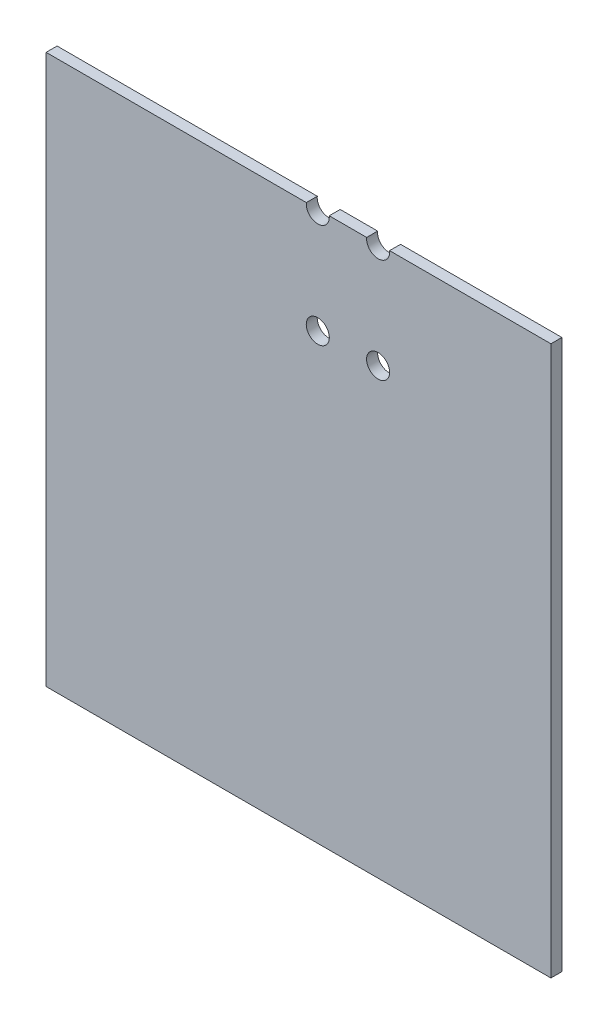
ISO-10303-21;
HEADER;
FILE_DESCRIPTION(('STEP AP214'),'2;1');
FILE_NAME('part.step','',(''),(''),'','','');
FILE_SCHEMA(('AUTOMOTIVE_DESIGN { 1 0 10303 214 1 1 1 1 }'));
ENDSEC;
DATA;
#1=APPLICATION_CONTEXT('core data for automotive mechanical design processes');
#2=APPLICATION_PROTOCOL_DEFINITION('international standard','automotive_design',2000,#1);
#3=PRODUCT_CONTEXT('',#1,'mechanical');
#4=PRODUCT('Part','Part','',(#3));
#5=PRODUCT_RELATED_PRODUCT_CATEGORY('part','',(#4));
#6=PRODUCT_DEFINITION_FORMATION('','',#4);
#7=PRODUCT_DEFINITION_CONTEXT('part definition',#1,'design');
#8=PRODUCT_DEFINITION('design','',#6,#7);
#9=PRODUCT_DEFINITION_SHAPE('','',#8);
#10=(LENGTH_UNIT() NAMED_UNIT(*) SI_UNIT(.MILLI.,.METRE.));
#11=(NAMED_UNIT(*) PLANE_ANGLE_UNIT() SI_UNIT($,.RADIAN.));
#12=(NAMED_UNIT(*) SI_UNIT($,.STERADIAN.) SOLID_ANGLE_UNIT());
#13=UNCERTAINTY_MEASURE_WITH_UNIT(LENGTH_MEASURE(1.E-05),#10,'distance_accuracy_value','');
#14=(GEOMETRIC_REPRESENTATION_CONTEXT(3) GLOBAL_UNCERTAINTY_ASSIGNED_CONTEXT((#13)) GLOBAL_UNIT_ASSIGNED_CONTEXT((#10,
#11,#12)) REPRESENTATION_CONTEXT('',''));
#15=CARTESIAN_POINT('',(0.,0.,0.));
#16=DIRECTION('',(0.,0.,1.));
#17=DIRECTION('',(1.,0.,0.));
#18=AXIS2_PLACEMENT_3D('',#15,#16,#17);
#19=CARTESIAN_POINT('',(0.,0.,222.103339909379));
#20=DIRECTION('',(0.,0.,1.));
#21=DIRECTION('',(1.,0.,0.));
#22=AXIS2_PLACEMENT_3D('',#19,#20,#21);
#23=PLANE('',#22);
#24=CARTESIAN_POINT('',(91.8978408750639,-108.752400596862,222.103339909379));
#25=DIRECTION('',(0.,0.,-1.));
#26=DIRECTION('',(-1.,0.,0.));
#27=AXIS2_PLACEMENT_3D('',#24,#25,#26);
#28=CIRCLE('',#27,4.2);
#29=CARTESIAN_POINT('',(87.6978408750639,-108.752400596862,222.103339909379));
#30=VERTEX_POINT('',#29);
#31=EDGE_CURVE('E165',#30,#30,#28,.T.);
#32=ORIENTED_EDGE('',*,*,#31,.T.);
#33=EDGE_LOOP('',(#32));
#34=FACE_BOUND('',#33,.T.);
#35=CARTESIAN_POINT('',(69.8978408750639,-108.752400596862,222.103339909379));
#36=DIRECTION('',(0.,0.,-1.));
#37=DIRECTION('',(-1.,0.,0.));
#38=AXIS2_PLACEMENT_3D('',#35,#36,#37);
#39=CIRCLE('',#38,4.19999999999998);
#40=CARTESIAN_POINT('',(65.6978408750639,-108.752400596862,222.103339909379));
#41=VERTEX_POINT('',#40);
#42=EDGE_CURVE('E130',#41,#41,#39,.T.);
#43=ORIENTED_EDGE('',*,*,#42,.T.);
#44=EDGE_LOOP('',(#43));
#45=FACE_BOUND('',#44,.T.);
#46=DIRECTION('',(-1.,0.,0.));
#47=VECTOR('',#46,1.);
#48=CARTESIAN_POINT('',(154.879048981557,-70.3032065745293,222.103339909379));
#49=LINE('',#48,#47);
#50=CARTESIAN_POINT('',(154.879048981557,-70.3032065745293,222.103339909379));
#51=VERTEX_POINT('',#50);
#52=CARTESIAN_POINT('',(96.0737509232212,-70.3032065745294,222.103339909379));
#53=VERTEX_POINT('',#52);
#54=EDGE_CURVE('E106',#51,#53,#49,.T.);
#55=ORIENTED_EDGE('',*,*,#54,.T.);
#56=CARTESIAN_POINT('',(91.897840875064,-70.7524005968622,222.103339909379));
#57=DIRECTION('',(0.,0.,-1.));
#58=DIRECTION('',(-1.,0.,0.));
#59=AXIS2_PLACEMENT_3D('',#56,#57,#58);
#60=CIRCLE('',#59,4.19999999999998);
#61=CARTESIAN_POINT('',(87.7219308269068,-70.3032065745294,222.103339909379));
#62=VERTEX_POINT('',#61);
#63=EDGE_CURVE('E48',#53,#62,#60,.T.);
#64=ORIENTED_EDGE('',*,*,#63,.T.);
#65=CARTESIAN_POINT('',(74.0737509232212,-70.3032065745294,222.103339909379));
#66=VERTEX_POINT('',#65);
#67=EDGE_CURVE('E104',#62,#66,#49,.T.);
#68=ORIENTED_EDGE('',*,*,#67,.T.);
#69=CARTESIAN_POINT('',(69.897840875064,-70.7524005968622,222.103339909379));
#70=DIRECTION('',(0.,0.,-1.));
#71=DIRECTION('',(-1.,0.,0.));
#72=AXIS2_PLACEMENT_3D('',#69,#70,#71);
#73=CIRCLE('',#72,4.2);
#74=CARTESIAN_POINT('',(65.7219308269067,-70.3032065745294,222.103339909379));
#75=VERTEX_POINT('',#74);
#76=EDGE_CURVE('E150',#66,#75,#73,.T.);
#77=ORIENTED_EDGE('',*,*,#76,.T.);
#78=CARTESIAN_POINT('',(-29.1209510184375,-70.3032065745294,222.103339909379));
#79=VERTEX_POINT('',#78);
#80=EDGE_CURVE('E113',#75,#79,#49,.T.);
#81=ORIENTED_EDGE('',*,*,#80,.T.);
#82=DIRECTION('',(0.,1.,0.));
#83=VECTOR('',#82,1.);
#84=CARTESIAN_POINT('',(-29.1209510184375,-270.520309161783,222.103339909379));
#85=LINE('',#84,#83);
#86=CARTESIAN_POINT('',(-29.1209510184375,-270.520309161783,222.103339909379));
#87=VERTEX_POINT('',#86);
#88=EDGE_CURVE('E115',#87,#79,#85,.T.);
#89=ORIENTED_EDGE('',*,*,#88,.F.);
#90=DIRECTION('',(-1.,0.,0.));
#91=VECTOR('',#90,1.);
#92=CARTESIAN_POINT('',(154.879048981557,-270.520309161783,222.103339909379));
#93=LINE('',#92,#91);
#94=CARTESIAN_POINT('',(154.879048981557,-270.520309161783,222.103339909379));
#95=VERTEX_POINT('',#94);
#96=EDGE_CURVE('E122',#95,#87,#93,.T.);
#97=ORIENTED_EDGE('',*,*,#96,.F.);
#98=DIRECTION('',(0.,1.,0.));
#99=VECTOR('',#98,1.);
#100=CARTESIAN_POINT('',(154.879048981557,-270.520309161783,222.103339909379));
#101=LINE('',#100,#99);
#102=EDGE_CURVE('E116',#95,#51,#101,.T.);
#103=ORIENTED_EDGE('',*,*,#102,.T.);
#104=EDGE_LOOP('',(#55,#64,#68,#77,#81,#89,#97,#103));
#105=FACE_BOUND('',#104,.T.);
#106=ADVANCED_FACE('F33',(#34,#45,#105),#23,.T.);
#107=CARTESIAN_POINT('',(154.879048981557,-70.3032065745293,222.103339909379));
#108=DIRECTION('',(0.,-1.,0.));
#109=DIRECTION('',(1.,0.,0.));
#110=AXIS2_PLACEMENT_3D('',#107,#108,#109);
#111=PLANE('',#110);
#112=ORIENTED_EDGE('',*,*,#67,.F.);
#113=DIRECTION('',(0.,0.,-1.));
#114=VECTOR('',#113,1.);
#115=CARTESIAN_POINT('',(87.7219308269068,-70.3032065745294,218.103339909379));
#116=LINE('',#115,#114);
#117=CARTESIAN_POINT('',(87.7219308269068,-70.3032065745294,218.103339909379));
#118=VERTEX_POINT('',#117);
#119=EDGE_CURVE('E11',#62,#118,#116,.T.);
#120=ORIENTED_EDGE('',*,*,#119,.T.);
#121=DIRECTION('',(-1.,0.,0.));
#122=VECTOR('',#121,1.);
#123=CARTESIAN_POINT('',(154.879048981557,-70.3032065745293,218.103339909379));
#124=LINE('',#123,#122);
#125=CARTESIAN_POINT('',(74.0737509232212,-70.3032065745294,218.103339909379));
#126=VERTEX_POINT('',#125);
#127=EDGE_CURVE('E135',#118,#126,#124,.T.);
#128=ORIENTED_EDGE('',*,*,#127,.T.);
#129=DIRECTION('',(0.,0.,-1.));
#130=VECTOR('',#129,1.);
#131=CARTESIAN_POINT('',(74.0737509232212,-70.3032065745294,218.103339909379));
#132=LINE('',#131,#130);
#133=EDGE_CURVE('E112',#126,#66,#132,.F.);
#134=ORIENTED_EDGE('',*,*,#133,.T.);
#135=EDGE_LOOP('',(#112,#120,#128,#134));
#136=FACE_BOUND('',#135,.T.);
#137=ADVANCED_FACE('F110',(#136),#111,.F.);
#138=CARTESIAN_POINT('',(0.,0.,218.103339909379));
#139=DIRECTION('',(0.,0.,1.));
#140=DIRECTION('',(1.,0.,0.));
#141=AXIS2_PLACEMENT_3D('',#138,#139,#140);
#142=PLANE('',#141);
#143=CARTESIAN_POINT('',(69.8978408750639,-108.752400596862,218.103339909379));
#144=DIRECTION('',(0.,0.,-1.));
#145=DIRECTION('',(-1.,0.,0.));
#146=AXIS2_PLACEMENT_3D('',#143,#144,#145);
#147=CIRCLE('',#146,4.19999999999998);
#148=CARTESIAN_POINT('',(65.6978408750639,-108.752400596862,218.103339909379));
#149=VERTEX_POINT('',#148);
#150=EDGE_CURVE('E168',#149,#149,#147,.T.);
#151=ORIENTED_EDGE('',*,*,#150,.F.);
#152=EDGE_LOOP('',(#151));
#153=FACE_BOUND('',#152,.T.);
#154=CARTESIAN_POINT('',(91.8978408750639,-108.752400596862,218.103339909379));
#155=DIRECTION('',(0.,0.,-1.));
#156=DIRECTION('',(-1.,0.,0.));
#157=AXIS2_PLACEMENT_3D('',#154,#155,#156);
#158=CIRCLE('',#157,4.2);
#159=CARTESIAN_POINT('',(87.6978408750639,-108.752400596862,218.103339909379));
#160=VERTEX_POINT('',#159);
#161=EDGE_CURVE('E161',#160,#160,#158,.T.);
#162=ORIENTED_EDGE('',*,*,#161,.F.);
#163=EDGE_LOOP('',(#162));
#164=FACE_BOUND('',#163,.T.);
#165=ORIENTED_EDGE('',*,*,#127,.F.);
#166=CARTESIAN_POINT('',(91.897840875064,-70.7524005968622,218.103339909379));
#167=DIRECTION('',(0.,0.,-1.));
#168=DIRECTION('',(-1.,0.,0.));
#169=AXIS2_PLACEMENT_3D('',#166,#167,#168);
#170=CIRCLE('',#169,4.19999999999998);
#171=CARTESIAN_POINT('',(96.0737509232212,-70.3032065745294,218.103339909379));
#172=VERTEX_POINT('',#171);
#173=EDGE_CURVE('E98',#172,#118,#170,.T.);
#174=ORIENTED_EDGE('',*,*,#173,.F.);
#175=CARTESIAN_POINT('',(154.879048981557,-70.3032065745293,218.103339909379));
#176=VERTEX_POINT('',#175);
#177=EDGE_CURVE('E131',#176,#172,#124,.T.);
#178=ORIENTED_EDGE('',*,*,#177,.F.);
#179=DIRECTION('',(0.,1.,0.));
#180=VECTOR('',#179,1.);
#181=CARTESIAN_POINT('',(154.879048981557,-270.520309161783,218.103339909379));
#182=LINE('',#181,#180);
#183=CARTESIAN_POINT('',(154.879048981557,-270.520309161783,218.103339909379));
#184=VERTEX_POINT('',#183);
#185=EDGE_CURVE('E126',#184,#176,#182,.T.);
#186=ORIENTED_EDGE('',*,*,#185,.F.);
#187=DIRECTION('',(-1.,0.,0.));
#188=VECTOR('',#187,1.);
#189=CARTESIAN_POINT('',(154.879048981557,-270.520309161783,218.103339909379));
#190=LINE('',#189,#188);
#191=CARTESIAN_POINT('',(-29.1209510184375,-270.520309161783,218.103339909379));
#192=VERTEX_POINT('',#191);
#193=EDGE_CURVE('E138',#184,#192,#190,.T.);
#194=ORIENTED_EDGE('',*,*,#193,.T.);
#195=DIRECTION('',(0.,1.,0.));
#196=VECTOR('',#195,1.);
#197=CARTESIAN_POINT('',(-29.1209510184375,-270.520309161783,218.103339909379));
#198=LINE('',#197,#196);
#199=CARTESIAN_POINT('',(-29.1209510184375,-70.3032065745294,218.103339909379));
#200=VERTEX_POINT('',#199);
#201=EDGE_CURVE('E134',#192,#200,#198,.T.);
#202=ORIENTED_EDGE('',*,*,#201,.T.);
#203=CARTESIAN_POINT('',(65.7219308269067,-70.3032065745294,218.103339909379));
#204=VERTEX_POINT('',#203);
#205=EDGE_CURVE('E129',#204,#200,#124,.T.);
#206=ORIENTED_EDGE('',*,*,#205,.F.);
#207=CARTESIAN_POINT('',(69.897840875064,-70.7524005968622,218.103339909379));
#208=DIRECTION('',(0.,0.,-1.));
#209=DIRECTION('',(-1.,0.,0.));
#210=AXIS2_PLACEMENT_3D('',#207,#208,#209);
#211=CIRCLE('',#210,4.2);
#212=EDGE_CURVE('E107',#126,#204,#211,.T.);
#213=ORIENTED_EDGE('',*,*,#212,.F.);
#214=EDGE_LOOP('',(#165,#174,#178,#186,#194,#202,#206,#213));
#215=FACE_BOUND('',#214,.T.);
#216=ADVANCED_FACE('F155',(#153,#164,#215),#142,.F.);
#217=ORIENTED_EDGE('',*,*,#80,.F.);
#218=DIRECTION('',(0.,0.,-1.));
#219=VECTOR('',#218,1.);
#220=CARTESIAN_POINT('',(65.7219308269067,-70.3032065745294,218.103339909379));
#221=LINE('',#220,#219);
#222=EDGE_CURVE('E56',#75,#204,#221,.T.);
#223=ORIENTED_EDGE('',*,*,#222,.T.);
#224=ORIENTED_EDGE('',*,*,#205,.T.);
#225=DIRECTION('',(0.,0.,-1.));
#226=VECTOR('',#225,1.);
#227=CARTESIAN_POINT('',(-29.1209510184375,-70.3032065745294,222.103339909379));
#228=LINE('',#227,#226);
#229=EDGE_CURVE('E144',#79,#200,#228,.T.);
#230=ORIENTED_EDGE('',*,*,#229,.F.);
#231=EDGE_LOOP('',(#217,#223,#224,#230));
#232=FACE_BOUND('',#231,.T.);
#233=ADVANCED_FACE('F184',(#232),#111,.F.);
#234=CARTESIAN_POINT('',(154.879048981557,-270.520309161783,222.103339909379));
#235=DIRECTION('',(-1.,0.,0.));
#236=DIRECTION('',(0.,0.,1.));
#237=AXIS2_PLACEMENT_3D('',#234,#235,#236);
#238=PLANE('',#237);
#239=ORIENTED_EDGE('',*,*,#185,.T.);
#240=DIRECTION('',(0.,0.,-1.));
#241=VECTOR('',#240,1.);
#242=CARTESIAN_POINT('',(154.879048981557,-70.3032065745293,222.103339909379));
#243=LINE('',#242,#241);
#244=EDGE_CURVE('E147',#51,#176,#243,.T.);
#245=ORIENTED_EDGE('',*,*,#244,.F.);
#246=ORIENTED_EDGE('',*,*,#102,.F.);
#247=DIRECTION('',(0.,0.,-1.));
#248=VECTOR('',#247,1.);
#249=CARTESIAN_POINT('',(154.879048981557,-270.520309161783,222.103339909379));
#250=LINE('',#249,#248);
#251=EDGE_CURVE('E125',#95,#184,#250,.T.);
#252=ORIENTED_EDGE('',*,*,#251,.T.);
#253=EDGE_LOOP('',(#239,#245,#246,#252));
#254=FACE_BOUND('',#253,.T.);
#255=ADVANCED_FACE('F35',(#254),#238,.F.);
#256=ORIENTED_EDGE('',*,*,#177,.T.);
#257=DIRECTION('',(0.,0.,-1.));
#258=VECTOR('',#257,1.);
#259=CARTESIAN_POINT('',(96.0737509232212,-70.3032065745294,218.103339909379));
#260=LINE('',#259,#258);
#261=EDGE_CURVE('E41',#172,#53,#260,.F.);
#262=ORIENTED_EDGE('',*,*,#261,.T.);
#263=ORIENTED_EDGE('',*,*,#54,.F.);
#264=ORIENTED_EDGE('',*,*,#244,.T.);
#265=EDGE_LOOP('',(#256,#262,#263,#264));
#266=FACE_BOUND('',#265,.T.);
#267=ADVANCED_FACE('F153',(#266),#111,.F.);
#268=CARTESIAN_POINT('',(-29.1209510184375,-270.520309161783,222.103339909379));
#269=DIRECTION('',(-1.,0.,0.));
#270=DIRECTION('',(0.,-1.,0.));
#271=AXIS2_PLACEMENT_3D('',#268,#269,#270);
#272=PLANE('',#271);
#273=ORIENTED_EDGE('',*,*,#201,.F.);
#274=DIRECTION('',(0.,0.,-1.));
#275=VECTOR('',#274,1.);
#276=CARTESIAN_POINT('',(-29.1209510184375,-270.520309161783,222.103339909379));
#277=LINE('',#276,#275);
#278=EDGE_CURVE('E142',#87,#192,#277,.T.);
#279=ORIENTED_EDGE('',*,*,#278,.F.);
#280=ORIENTED_EDGE('',*,*,#88,.T.);
#281=ORIENTED_EDGE('',*,*,#229,.T.);
#282=EDGE_LOOP('',(#273,#279,#280,#281));
#283=FACE_BOUND('',#282,.T.);
#284=ADVANCED_FACE('F206',(#283),#272,.T.);
#285=CARTESIAN_POINT('',(154.879048981557,-270.520309161783,222.103339909379));
#286=DIRECTION('',(0.,-1.,0.));
#287=DIRECTION('',(0.,0.,-1.));
#288=AXIS2_PLACEMENT_3D('',#285,#286,#287);
#289=PLANE('',#288);
#290=ORIENTED_EDGE('',*,*,#193,.F.);
#291=ORIENTED_EDGE('',*,*,#251,.F.);
#292=ORIENTED_EDGE('',*,*,#96,.T.);
#293=ORIENTED_EDGE('',*,*,#278,.T.);
#294=EDGE_LOOP('',(#290,#291,#292,#293));
#295=FACE_BOUND('',#294,.T.);
#296=ADVANCED_FACE('F178',(#295),#289,.T.);
#297=CARTESIAN_POINT('',(69.8978408750639,-108.752400596862,218.103339909379));
#298=DIRECTION('',(0.,0.,-1.));
#299=DIRECTION('',(-1.,0.,0.));
#300=AXIS2_PLACEMENT_3D('',#297,#298,#299);
#301=CYLINDRICAL_SURFACE('',#300,4.19999999999998);
#302=ORIENTED_EDGE('',*,*,#42,.F.);
#303=EDGE_LOOP('',(#302));
#304=FACE_BOUND('',#303,.T.);
#305=ORIENTED_EDGE('',*,*,#150,.T.);
#306=EDGE_LOOP('',(#305));
#307=FACE_BOUND('',#306,.T.);
#308=ADVANCED_FACE('F174',(#304,#307),#301,.F.);
#309=CARTESIAN_POINT('',(91.8978408750639,-108.752400596862,218.103339909379));
#310=DIRECTION('',(0.,0.,-1.));
#311=DIRECTION('',(-1.,0.,0.));
#312=AXIS2_PLACEMENT_3D('',#309,#310,#311);
#313=CYLINDRICAL_SURFACE('',#312,4.2);
#314=ORIENTED_EDGE('',*,*,#31,.F.);
#315=EDGE_LOOP('',(#314));
#316=FACE_BOUND('',#315,.T.);
#317=ORIENTED_EDGE('',*,*,#161,.T.);
#318=EDGE_LOOP('',(#317));
#319=FACE_BOUND('',#318,.T.);
#320=ADVANCED_FACE('F177',(#316,#319),#313,.F.);
#321=CARTESIAN_POINT('',(69.897840875064,-70.7524005968622,218.103339909379));
#322=DIRECTION('',(0.,0.,-1.));
#323=DIRECTION('',(-1.,0.,0.));
#324=AXIS2_PLACEMENT_3D('',#321,#322,#323);
#325=CYLINDRICAL_SURFACE('',#324,4.2);
#326=ORIENTED_EDGE('',*,*,#76,.F.);
#327=ORIENTED_EDGE('',*,*,#133,.F.);
#328=ORIENTED_EDGE('',*,*,#212,.T.);
#329=ORIENTED_EDGE('',*,*,#222,.F.);
#330=EDGE_LOOP('',(#326,#327,#328,#329));
#331=FACE_BOUND('',#330,.T.);
#332=ADVANCED_FACE('F189',(#331),#325,.F.);
#333=CARTESIAN_POINT('',(91.897840875064,-70.7524005968622,218.103339909379));
#334=DIRECTION('',(0.,0.,-1.));
#335=DIRECTION('',(-1.,0.,0.));
#336=AXIS2_PLACEMENT_3D('',#333,#334,#335);
#337=CYLINDRICAL_SURFACE('',#336,4.19999999999998);
#338=ORIENTED_EDGE('',*,*,#63,.F.);
#339=ORIENTED_EDGE('',*,*,#261,.F.);
#340=ORIENTED_EDGE('',*,*,#173,.T.);
#341=ORIENTED_EDGE('',*,*,#119,.F.);
#342=EDGE_LOOP('',(#338,#339,#340,#341));
#343=FACE_BOUND('',#342,.T.);
#344=ADVANCED_FACE('F96',(#343),#337,.F.);
#345=CLOSED_SHELL('',(#106,#137,#216,#233,#255,#267,#284,#296,#308,#320,#332,#344));
#346=MANIFOLD_SOLID_BREP('B2',#345);
#347=ADVANCED_BREP_SHAPE_REPRESENTATION('',(#18,#346),#14);
#348=SHAPE_DEFINITION_REPRESENTATION(#9,#347);
ENDSEC;
END-ISO-10303-21;
